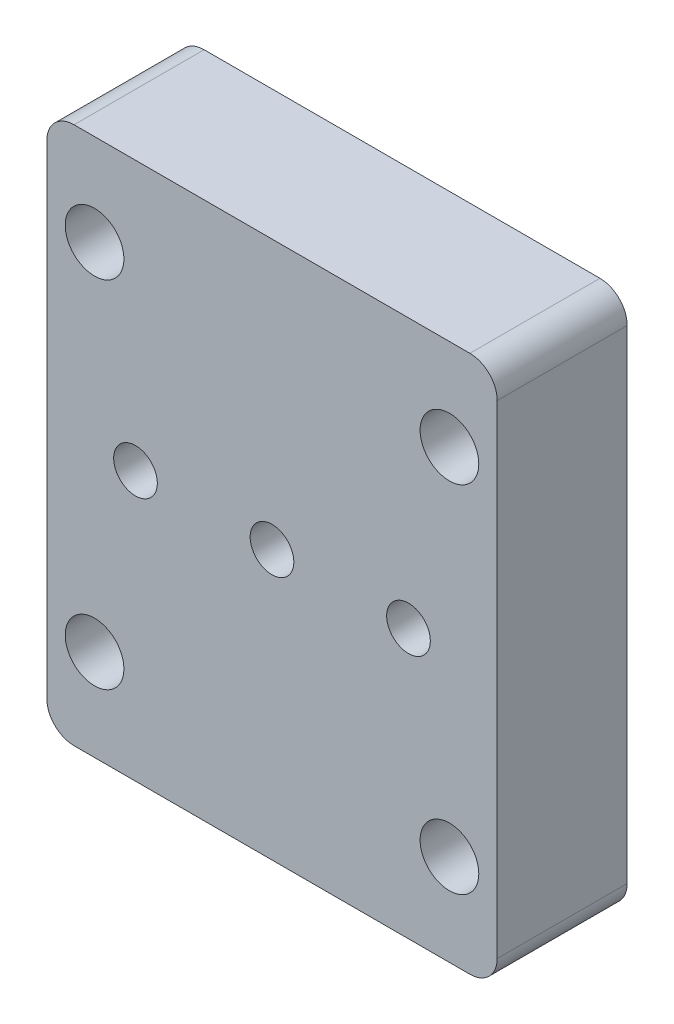
ISO-10303-21;
HEADER;
FILE_DESCRIPTION(('STEP AP214'),'2;1');
FILE_NAME('part.step','',(''),(''),'','','');
FILE_SCHEMA(('AUTOMOTIVE_DESIGN { 1 0 10303 214 1 1 1 1 }'));
ENDSEC;
DATA;
#1=APPLICATION_CONTEXT('core data for automotive mechanical design processes');
#2=APPLICATION_PROTOCOL_DEFINITION('international standard','automotive_design',2000,#1);
#3=PRODUCT_CONTEXT('',#1,'mechanical');
#4=PRODUCT('Part','Part','',(#3));
#5=PRODUCT_RELATED_PRODUCT_CATEGORY('part','',(#4));
#6=PRODUCT_DEFINITION_FORMATION('','',#4);
#7=PRODUCT_DEFINITION_CONTEXT('part definition',#1,'design');
#8=PRODUCT_DEFINITION('design','',#6,#7);
#9=PRODUCT_DEFINITION_SHAPE('','',#8);
#10=(LENGTH_UNIT() NAMED_UNIT(*) SI_UNIT(.MILLI.,.METRE.));
#11=(NAMED_UNIT(*) PLANE_ANGLE_UNIT() SI_UNIT($,.RADIAN.));
#12=(NAMED_UNIT(*) SI_UNIT($,.STERADIAN.) SOLID_ANGLE_UNIT());
#13=UNCERTAINTY_MEASURE_WITH_UNIT(LENGTH_MEASURE(1.E-05),#10,'distance_accuracy_value','');
#14=(GEOMETRIC_REPRESENTATION_CONTEXT(3) GLOBAL_UNCERTAINTY_ASSIGNED_CONTEXT((#13)) GLOBAL_UNIT_ASSIGNED_CONTEXT((#10,
#11,#12)) REPRESENTATION_CONTEXT('',''));
#15=CARTESIAN_POINT('',(0.,0.,0.));
#16=DIRECTION('',(0.,0.,1.));
#17=DIRECTION('',(1.,0.,0.));
#18=AXIS2_PLACEMENT_3D('',#15,#16,#17);
#19=CARTESIAN_POINT('',(-16.5,-19.7,9.525));
#20=DIRECTION('',(1.,0.,0.));
#21=DIRECTION('',(0.,0.,-1.));
#22=AXIS2_PLACEMENT_3D('',#19,#20,#21);
#23=PLANE('',#22);
#24=DIRECTION('',(0.,-1.,0.));
#25=VECTOR('',#24,1.);
#26=CARTESIAN_POINT('',(-16.5,-19.7,0.));
#27=LINE('',#26,#25);
#28=CARTESIAN_POINT('',(-16.5,17.7,0.));
#29=VERTEX_POINT('',#28);
#30=CARTESIAN_POINT('',(-16.5,-17.7,0.));
#31=VERTEX_POINT('',#30);
#32=EDGE_CURVE('E161',#29,#31,#27,.T.);
#33=ORIENTED_EDGE('',*,*,#32,.T.);
#34=DIRECTION('',(0.,0.,-1.));
#35=VECTOR('',#34,1.);
#36=CARTESIAN_POINT('',(-16.5,-17.7,9.525));
#37=LINE('',#36,#35);
#38=CARTESIAN_POINT('',(-16.5,-17.7,9.525));
#39=VERTEX_POINT('',#38);
#40=EDGE_CURVE('E11',#31,#39,#37,.F.);
#41=ORIENTED_EDGE('',*,*,#40,.T.);
#42=DIRECTION('',(0.,-1.,0.));
#43=VECTOR('',#42,1.);
#44=CARTESIAN_POINT('',(-16.5,-19.7,9.525));
#45=LINE('',#44,#43);
#46=CARTESIAN_POINT('',(-16.5,17.7,9.525));
#47=VERTEX_POINT('',#46);
#48=EDGE_CURVE('E129',#47,#39,#45,.T.);
#49=ORIENTED_EDGE('',*,*,#48,.F.);
#50=DIRECTION('',(0.,0.,-1.));
#51=VECTOR('',#50,1.);
#52=CARTESIAN_POINT('',(-16.5,17.7,9.525));
#53=LINE('',#52,#51);
#54=EDGE_CURVE('E45',#47,#29,#53,.T.);
#55=ORIENTED_EDGE('',*,*,#54,.T.);
#56=EDGE_LOOP('',(#33,#41,#49,#55));
#57=FACE_BOUND('',#56,.T.);
#58=ADVANCED_FACE('F37',(#57),#23,.F.);
#59=CARTESIAN_POINT('',(16.5,-19.7,9.525));
#60=DIRECTION('',(0.,1.,0.));
#61=DIRECTION('',(0.,0.,1.));
#62=AXIS2_PLACEMENT_3D('',#59,#60,#61);
#63=PLANE('',#62);
#64=DIRECTION('',(1.,0.,0.));
#65=VECTOR('',#64,1.);
#66=CARTESIAN_POINT('',(16.5,-19.7,0.));
#67=LINE('',#66,#65);
#68=CARTESIAN_POINT('',(-14.5,-19.7,0.));
#69=VERTEX_POINT('',#68);
#70=CARTESIAN_POINT('',(14.5,-19.7,0.));
#71=VERTEX_POINT('',#70);
#72=EDGE_CURVE('E134',#69,#71,#67,.T.);
#73=ORIENTED_EDGE('',*,*,#72,.T.);
#74=DIRECTION('',(0.,0.,-1.));
#75=VECTOR('',#74,1.);
#76=CARTESIAN_POINT('',(14.5,-19.7,9.525));
#77=LINE('',#76,#75);
#78=CARTESIAN_POINT('',(14.5,-19.7,9.525));
#79=VERTEX_POINT('',#78);
#80=EDGE_CURVE('E52',#71,#79,#77,.F.);
#81=ORIENTED_EDGE('',*,*,#80,.T.);
#82=DIRECTION('',(1.,0.,0.));
#83=VECTOR('',#82,1.);
#84=CARTESIAN_POINT('',(16.5,-19.7,9.525));
#85=LINE('',#84,#83);
#86=CARTESIAN_POINT('',(-14.5,-19.7,9.525));
#87=VERTEX_POINT('',#86);
#88=EDGE_CURVE('E132',#87,#79,#85,.T.);
#89=ORIENTED_EDGE('',*,*,#88,.F.);
#90=DIRECTION('',(0.,0.,-1.));
#91=VECTOR('',#90,1.);
#92=CARTESIAN_POINT('',(-14.5,-19.7,9.525));
#93=LINE('',#92,#91);
#94=EDGE_CURVE('E153',#87,#69,#93,.T.);
#95=ORIENTED_EDGE('',*,*,#94,.T.);
#96=EDGE_LOOP('',(#73,#81,#89,#95));
#97=FACE_BOUND('',#96,.T.);
#98=ADVANCED_FACE('F240',(#97),#63,.F.);
#99=CARTESIAN_POINT('',(16.5,-19.7,9.525));
#100=DIRECTION('',(-1.,0.,0.));
#101=DIRECTION('',(0.,0.,1.));
#102=AXIS2_PLACEMENT_3D('',#99,#100,#101);
#103=PLANE('',#102);
#104=DIRECTION('',(0.,1.,0.));
#105=VECTOR('',#104,1.);
#106=CARTESIAN_POINT('',(16.5,-19.7,0.));
#107=LINE('',#106,#105);
#108=CARTESIAN_POINT('',(16.5,-17.7,0.));
#109=VERTEX_POINT('',#108);
#110=CARTESIAN_POINT('',(16.5,17.7,0.));
#111=VERTEX_POINT('',#110);
#112=EDGE_CURVE('E130',#109,#111,#107,.T.);
#113=ORIENTED_EDGE('',*,*,#112,.T.);
#114=DIRECTION('',(0.,0.,-1.));
#115=VECTOR('',#114,1.);
#116=CARTESIAN_POINT('',(16.5,17.7,9.525));
#117=LINE('',#116,#115);
#118=CARTESIAN_POINT('',(16.5,17.7,9.525));
#119=VERTEX_POINT('',#118);
#120=EDGE_CURVE('E108',#111,#119,#117,.F.);
#121=ORIENTED_EDGE('',*,*,#120,.T.);
#122=DIRECTION('',(0.,1.,0.));
#123=VECTOR('',#122,1.);
#124=CARTESIAN_POINT('',(16.5,-19.7,9.525));
#125=LINE('',#124,#123);
#126=CARTESIAN_POINT('',(16.5,-17.7,9.525));
#127=VERTEX_POINT('',#126);
#128=EDGE_CURVE('E173',#127,#119,#125,.T.);
#129=ORIENTED_EDGE('',*,*,#128,.F.);
#130=DIRECTION('',(0.,0.,-1.));
#131=VECTOR('',#130,1.);
#132=CARTESIAN_POINT('',(16.5,-17.7,9.525));
#133=LINE('',#132,#131);
#134=EDGE_CURVE('E113',#127,#109,#133,.T.);
#135=ORIENTED_EDGE('',*,*,#134,.T.);
#136=EDGE_LOOP('',(#113,#121,#129,#135));
#137=FACE_BOUND('',#136,.T.);
#138=ADVANCED_FACE('F237',(#137),#103,.F.);
#139=CARTESIAN_POINT('',(16.5,19.7,9.525));
#140=DIRECTION('',(0.,-1.,0.));
#141=DIRECTION('',(1.,0.,0.));
#142=AXIS2_PLACEMENT_3D('',#139,#140,#141);
#143=PLANE('',#142);
#144=DIRECTION('',(-1.,0.,0.));
#145=VECTOR('',#144,1.);
#146=CARTESIAN_POINT('',(16.5,19.7,9.525));
#147=LINE('',#146,#145);
#148=CARTESIAN_POINT('',(14.5,19.7,9.525));
#149=VERTEX_POINT('',#148);
#150=CARTESIAN_POINT('',(-14.5,19.7,9.525));
#151=VERTEX_POINT('',#150);
#152=EDGE_CURVE('E123',#149,#151,#147,.T.);
#153=ORIENTED_EDGE('',*,*,#152,.F.);
#154=DIRECTION('',(0.,0.,-1.));
#155=VECTOR('',#154,1.);
#156=CARTESIAN_POINT('',(14.5,19.7,9.525));
#157=LINE('',#156,#155);
#158=CARTESIAN_POINT('',(14.5,19.7,0.));
#159=VERTEX_POINT('',#158);
#160=EDGE_CURVE('E107',#149,#159,#157,.T.);
#161=ORIENTED_EDGE('',*,*,#160,.T.);
#162=DIRECTION('',(-1.,0.,0.));
#163=VECTOR('',#162,1.);
#164=CARTESIAN_POINT('',(16.5,19.7,0.));
#165=LINE('',#164,#163);
#166=CARTESIAN_POINT('',(-14.5,19.7,0.));
#167=VERTEX_POINT('',#166);
#168=EDGE_CURVE('E120',#159,#167,#165,.T.);
#169=ORIENTED_EDGE('',*,*,#168,.T.);
#170=DIRECTION('',(0.,0.,-1.));
#171=VECTOR('',#170,1.);
#172=CARTESIAN_POINT('',(-14.5,19.7,9.525));
#173=LINE('',#172,#171);
#174=EDGE_CURVE('E125',#167,#151,#173,.F.);
#175=ORIENTED_EDGE('',*,*,#174,.T.);
#176=EDGE_LOOP('',(#153,#161,#169,#175));
#177=FACE_BOUND('',#176,.T.);
#178=ADVANCED_FACE('F119',(#177),#143,.F.);
#179=CARTESIAN_POINT('',(0.,0.,9.525));
#180=DIRECTION('',(0.,0.,1.));
#181=DIRECTION('',(1.,0.,0.));
#182=AXIS2_PLACEMENT_3D('',#179,#180,#181);
#183=PLANE('',#182);
#184=CARTESIAN_POINT('',(-13.,13.,9.525));
#185=DIRECTION('',(0.,0.,1.));
#186=DIRECTION('',(1.,0.,0.));
#187=AXIS2_PLACEMENT_3D('',#184,#185,#186);
#188=CIRCLE('',#187,2.15);
#189=CARTESIAN_POINT('',(-10.85,13.,9.525));
#190=VERTEX_POINT('',#189);
#191=EDGE_CURVE('E212',#190,#190,#188,.T.);
#192=ORIENTED_EDGE('',*,*,#191,.F.);
#193=EDGE_LOOP('',(#192));
#194=FACE_BOUND('',#193,.T.);
#195=CARTESIAN_POINT('',(-13.,-13.,9.525));
#196=DIRECTION('',(0.,0.,1.));
#197=DIRECTION('',(1.,0.,0.));
#198=AXIS2_PLACEMENT_3D('',#195,#196,#197);
#199=CIRCLE('',#198,2.15);
#200=CARTESIAN_POINT('',(-10.85,-13.,9.525));
#201=VERTEX_POINT('',#200);
#202=EDGE_CURVE('E206',#201,#201,#199,.T.);
#203=ORIENTED_EDGE('',*,*,#202,.F.);
#204=EDGE_LOOP('',(#203));
#205=FACE_BOUND('',#204,.T.);
#206=CARTESIAN_POINT('',(13.,-13.,9.525));
#207=DIRECTION('',(0.,0.,1.));
#208=DIRECTION('',(1.,0.,0.));
#209=AXIS2_PLACEMENT_3D('',#206,#207,#208);
#210=CIRCLE('',#209,2.15);
#211=CARTESIAN_POINT('',(15.15,-13.,9.525));
#212=VERTEX_POINT('',#211);
#213=EDGE_CURVE('E200',#212,#212,#210,.T.);
#214=ORIENTED_EDGE('',*,*,#213,.F.);
#215=EDGE_LOOP('',(#214));
#216=FACE_BOUND('',#215,.T.);
#217=CARTESIAN_POINT('',(13.,13.,9.525));
#218=DIRECTION('',(0.,0.,1.));
#219=DIRECTION('',(1.,0.,0.));
#220=AXIS2_PLACEMENT_3D('',#217,#218,#219);
#221=CIRCLE('',#220,2.15);
#222=CARTESIAN_POINT('',(15.15,13.,9.525));
#223=VERTEX_POINT('',#222);
#224=EDGE_CURVE('E194',#223,#223,#221,.T.);
#225=ORIENTED_EDGE('',*,*,#224,.F.);
#226=EDGE_LOOP('',(#225));
#227=FACE_BOUND('',#226,.T.);
#228=CARTESIAN_POINT('',(-10.,0.,9.525));
#229=DIRECTION('',(0.,0.,1.));
#230=DIRECTION('',(1.,0.,0.));
#231=AXIS2_PLACEMENT_3D('',#228,#229,#230);
#232=CIRCLE('',#231,1.6);
#233=CARTESIAN_POINT('',(-8.4,0.,9.525));
#234=VERTEX_POINT('',#233);
#235=EDGE_CURVE('E188',#234,#234,#232,.T.);
#236=ORIENTED_EDGE('',*,*,#235,.F.);
#237=EDGE_LOOP('',(#236));
#238=FACE_BOUND('',#237,.T.);
#239=CARTESIAN_POINT('',(0.,0.,9.525));
#240=DIRECTION('',(0.,0.,1.));
#241=DIRECTION('',(1.,0.,0.));
#242=AXIS2_PLACEMENT_3D('',#239,#240,#241);
#243=CIRCLE('',#242,1.6);
#244=CARTESIAN_POINT('',(1.6,0.,9.525));
#245=VERTEX_POINT('',#244);
#246=EDGE_CURVE('E182',#245,#245,#243,.T.);
#247=ORIENTED_EDGE('',*,*,#246,.F.);
#248=EDGE_LOOP('',(#247));
#249=FACE_BOUND('',#248,.T.);
#250=CARTESIAN_POINT('',(10.,0.,9.525));
#251=DIRECTION('',(0.,0.,1.));
#252=DIRECTION('',(1.,0.,0.));
#253=AXIS2_PLACEMENT_3D('',#250,#251,#252);
#254=CIRCLE('',#253,1.6);
#255=CARTESIAN_POINT('',(11.6,0.,9.525));
#256=VERTEX_POINT('',#255);
#257=EDGE_CURVE('E169',#256,#256,#254,.T.);
#258=ORIENTED_EDGE('',*,*,#257,.F.);
#259=EDGE_LOOP('',(#258));
#260=FACE_BOUND('',#259,.T.);
#261=ORIENTED_EDGE('',*,*,#128,.T.);
#262=CARTESIAN_POINT('',(14.5,17.7,9.525));
#263=DIRECTION('',(0.,0.,1.));
#264=DIRECTION('',(1.,0.,0.));
#265=AXIS2_PLACEMENT_3D('',#262,#263,#264);
#266=CIRCLE('',#265,2.);
#267=EDGE_CURVE('E151',#119,#149,#266,.T.);
#268=ORIENTED_EDGE('',*,*,#267,.T.);
#269=ORIENTED_EDGE('',*,*,#152,.T.);
#270=CARTESIAN_POINT('',(-14.5,17.7,9.525));
#271=DIRECTION('',(0.,0.,1.));
#272=DIRECTION('',(1.,0.,0.));
#273=AXIS2_PLACEMENT_3D('',#270,#271,#272);
#274=CIRCLE('',#273,2.);
#275=EDGE_CURVE('E146',#151,#47,#274,.T.);
#276=ORIENTED_EDGE('',*,*,#275,.T.);
#277=ORIENTED_EDGE('',*,*,#48,.T.);
#278=CARTESIAN_POINT('',(-14.5,-17.7,9.525));
#279=DIRECTION('',(0.,0.,1.));
#280=DIRECTION('',(1.,0.,0.));
#281=AXIS2_PLACEMENT_3D('',#278,#279,#280);
#282=CIRCLE('',#281,2.);
#283=EDGE_CURVE('E59',#39,#87,#282,.T.);
#284=ORIENTED_EDGE('',*,*,#283,.T.);
#285=ORIENTED_EDGE('',*,*,#88,.T.);
#286=CARTESIAN_POINT('',(14.5,-17.7,9.525));
#287=DIRECTION('',(0.,0.,1.));
#288=DIRECTION('',(1.,0.,0.));
#289=AXIS2_PLACEMENT_3D('',#286,#287,#288);
#290=CIRCLE('',#289,2.);
#291=EDGE_CURVE('E149',#79,#127,#290,.T.);
#292=ORIENTED_EDGE('',*,*,#291,.T.);
#293=EDGE_LOOP('',(#261,#268,#269,#276,#277,#284,#285,#292));
#294=FACE_BOUND('',#293,.T.);
#295=ADVANCED_FACE('F218',(#194,#205,#216,#227,#238,#249,#260,#294),#183,.T.);
#296=CARTESIAN_POINT('',(0.,0.,0.));
#297=DIRECTION('',(0.,0.,1.));
#298=DIRECTION('',(1.,0.,0.));
#299=AXIS2_PLACEMENT_3D('',#296,#297,#298);
#300=PLANE('',#299);
#301=CARTESIAN_POINT('',(-13.,13.,0.));
#302=DIRECTION('',(0.,0.,1.));
#303=DIRECTION('',(1.,0.,0.));
#304=AXIS2_PLACEMENT_3D('',#301,#302,#303);
#305=CIRCLE('',#304,2.15);
#306=CARTESIAN_POINT('',(-10.85,13.,0.));
#307=VERTEX_POINT('',#306);
#308=EDGE_CURVE('E209',#307,#307,#305,.T.);
#309=ORIENTED_EDGE('',*,*,#308,.T.);
#310=EDGE_LOOP('',(#309));
#311=FACE_BOUND('',#310,.T.);
#312=CARTESIAN_POINT('',(-13.,-13.,0.));
#313=DIRECTION('',(0.,0.,1.));
#314=DIRECTION('',(1.,0.,0.));
#315=AXIS2_PLACEMENT_3D('',#312,#313,#314);
#316=CIRCLE('',#315,2.15);
#317=CARTESIAN_POINT('',(-10.85,-13.,0.));
#318=VERTEX_POINT('',#317);
#319=EDGE_CURVE('E203',#318,#318,#316,.T.);
#320=ORIENTED_EDGE('',*,*,#319,.T.);
#321=EDGE_LOOP('',(#320));
#322=FACE_BOUND('',#321,.T.);
#323=CARTESIAN_POINT('',(13.,-13.,0.));
#324=DIRECTION('',(0.,0.,1.));
#325=DIRECTION('',(1.,0.,0.));
#326=AXIS2_PLACEMENT_3D('',#323,#324,#325);
#327=CIRCLE('',#326,2.15);
#328=CARTESIAN_POINT('',(15.15,-13.,0.));
#329=VERTEX_POINT('',#328);
#330=EDGE_CURVE('E197',#329,#329,#327,.T.);
#331=ORIENTED_EDGE('',*,*,#330,.T.);
#332=EDGE_LOOP('',(#331));
#333=FACE_BOUND('',#332,.T.);
#334=CARTESIAN_POINT('',(13.,13.,0.));
#335=DIRECTION('',(0.,0.,1.));
#336=DIRECTION('',(1.,0.,0.));
#337=AXIS2_PLACEMENT_3D('',#334,#335,#336);
#338=CIRCLE('',#337,2.15);
#339=CARTESIAN_POINT('',(15.15,13.,0.));
#340=VERTEX_POINT('',#339);
#341=EDGE_CURVE('E191',#340,#340,#338,.T.);
#342=ORIENTED_EDGE('',*,*,#341,.T.);
#343=EDGE_LOOP('',(#342));
#344=FACE_BOUND('',#343,.T.);
#345=CARTESIAN_POINT('',(-10.,0.,0.));
#346=DIRECTION('',(0.,0.,1.));
#347=DIRECTION('',(1.,0.,0.));
#348=AXIS2_PLACEMENT_3D('',#345,#346,#347);
#349=CIRCLE('',#348,1.6);
#350=CARTESIAN_POINT('',(-8.4,0.,0.));
#351=VERTEX_POINT('',#350);
#352=EDGE_CURVE('E185',#351,#351,#349,.T.);
#353=ORIENTED_EDGE('',*,*,#352,.T.);
#354=EDGE_LOOP('',(#353));
#355=FACE_BOUND('',#354,.T.);
#356=CARTESIAN_POINT('',(0.,0.,0.));
#357=DIRECTION('',(0.,0.,1.));
#358=DIRECTION('',(1.,0.,0.));
#359=AXIS2_PLACEMENT_3D('',#356,#357,#358);
#360=CIRCLE('',#359,1.6);
#361=CARTESIAN_POINT('',(1.6,0.,0.));
#362=VERTEX_POINT('',#361);
#363=EDGE_CURVE('E179',#362,#362,#360,.T.);
#364=ORIENTED_EDGE('',*,*,#363,.T.);
#365=EDGE_LOOP('',(#364));
#366=FACE_BOUND('',#365,.T.);
#367=CARTESIAN_POINT('',(10.,0.,0.));
#368=DIRECTION('',(0.,0.,1.));
#369=DIRECTION('',(1.,0.,0.));
#370=AXIS2_PLACEMENT_3D('',#367,#368,#369);
#371=CIRCLE('',#370,1.6);
#372=CARTESIAN_POINT('',(11.6,0.,0.));
#373=VERTEX_POINT('',#372);
#374=EDGE_CURVE('E166',#373,#373,#371,.T.);
#375=ORIENTED_EDGE('',*,*,#374,.T.);
#376=EDGE_LOOP('',(#375));
#377=FACE_BOUND('',#376,.T.);
#378=ORIENTED_EDGE('',*,*,#168,.F.);
#379=CARTESIAN_POINT('',(14.5,17.7,0.));
#380=DIRECTION('',(0.,0.,1.));
#381=DIRECTION('',(1.,0.,0.));
#382=AXIS2_PLACEMENT_3D('',#379,#380,#381);
#383=CIRCLE('',#382,2.);
#384=EDGE_CURVE('E103',#159,#111,#383,.F.);
#385=ORIENTED_EDGE('',*,*,#384,.T.);
#386=ORIENTED_EDGE('',*,*,#112,.F.);
#387=CARTESIAN_POINT('',(14.5,-17.7,0.));
#388=DIRECTION('',(0.,0.,1.));
#389=DIRECTION('',(1.,0.,0.));
#390=AXIS2_PLACEMENT_3D('',#387,#388,#389);
#391=CIRCLE('',#390,2.);
#392=EDGE_CURVE('E114',#109,#71,#391,.F.);
#393=ORIENTED_EDGE('',*,*,#392,.T.);
#394=ORIENTED_EDGE('',*,*,#72,.F.);
#395=CARTESIAN_POINT('',(-14.5,-17.7,0.));
#396=DIRECTION('',(0.,0.,1.));
#397=DIRECTION('',(1.,0.,0.));
#398=AXIS2_PLACEMENT_3D('',#395,#396,#397);
#399=CIRCLE('',#398,2.);
#400=EDGE_CURVE('E140',#69,#31,#399,.F.);
#401=ORIENTED_EDGE('',*,*,#400,.T.);
#402=ORIENTED_EDGE('',*,*,#32,.F.);
#403=CARTESIAN_POINT('',(-14.5,17.7,0.));
#404=DIRECTION('',(0.,0.,1.));
#405=DIRECTION('',(1.,0.,0.));
#406=AXIS2_PLACEMENT_3D('',#403,#404,#405);
#407=CIRCLE('',#406,2.);
#408=EDGE_CURVE('E124',#29,#167,#407,.F.);
#409=ORIENTED_EDGE('',*,*,#408,.T.);
#410=EDGE_LOOP('',(#378,#385,#386,#393,#394,#401,#402,#409));
#411=FACE_BOUND('',#410,.T.);
#412=ADVANCED_FACE('F127',(#311,#322,#333,#344,#355,#366,#377,#411),#300,.F.);
#413=CARTESIAN_POINT('',(10.,0.,9.525));
#414=DIRECTION('',(0.,0.,1.));
#415=DIRECTION('',(1.,0.,0.));
#416=AXIS2_PLACEMENT_3D('',#413,#414,#415);
#417=CYLINDRICAL_SURFACE('',#416,1.6);
#418=ORIENTED_EDGE('',*,*,#374,.F.);
#419=EDGE_LOOP('',(#418));
#420=FACE_BOUND('',#419,.T.);
#421=ORIENTED_EDGE('',*,*,#257,.T.);
#422=EDGE_LOOP('',(#421));
#423=FACE_BOUND('',#422,.T.);
#424=ADVANCED_FACE('F343',(#420,#423),#417,.F.);
#425=CARTESIAN_POINT('',(0.,0.,9.525));
#426=DIRECTION('',(0.,0.,1.));
#427=DIRECTION('',(1.,0.,0.));
#428=AXIS2_PLACEMENT_3D('',#425,#426,#427);
#429=CYLINDRICAL_SURFACE('',#428,1.6);
#430=ORIENTED_EDGE('',*,*,#363,.F.);
#431=EDGE_LOOP('',(#430));
#432=FACE_BOUND('',#431,.T.);
#433=ORIENTED_EDGE('',*,*,#246,.T.);
#434=EDGE_LOOP('',(#433));
#435=FACE_BOUND('',#434,.T.);
#436=ADVANCED_FACE('F333',(#432,#435),#429,.F.);
#437=CARTESIAN_POINT('',(-10.,0.,9.525));
#438=DIRECTION('',(0.,0.,1.));
#439=DIRECTION('',(1.,0.,0.));
#440=AXIS2_PLACEMENT_3D('',#437,#438,#439);
#441=CYLINDRICAL_SURFACE('',#440,1.6);
#442=ORIENTED_EDGE('',*,*,#352,.F.);
#443=EDGE_LOOP('',(#442));
#444=FACE_BOUND('',#443,.T.);
#445=ORIENTED_EDGE('',*,*,#235,.T.);
#446=EDGE_LOOP('',(#445));
#447=FACE_BOUND('',#446,.T.);
#448=ADVANCED_FACE('F323',(#444,#447),#441,.F.);
#449=CARTESIAN_POINT('',(13.,13.,9.525));
#450=DIRECTION('',(0.,0.,1.));
#451=DIRECTION('',(1.,0.,0.));
#452=AXIS2_PLACEMENT_3D('',#449,#450,#451);
#453=CYLINDRICAL_SURFACE('',#452,2.15);
#454=ORIENTED_EDGE('',*,*,#341,.F.);
#455=EDGE_LOOP('',(#454));
#456=FACE_BOUND('',#455,.T.);
#457=ORIENTED_EDGE('',*,*,#224,.T.);
#458=EDGE_LOOP('',(#457));
#459=FACE_BOUND('',#458,.T.);
#460=ADVANCED_FACE('F313',(#456,#459),#453,.F.);
#461=CARTESIAN_POINT('',(13.,-13.,9.525));
#462=DIRECTION('',(0.,0.,1.));
#463=DIRECTION('',(1.,0.,0.));
#464=AXIS2_PLACEMENT_3D('',#461,#462,#463);
#465=CYLINDRICAL_SURFACE('',#464,2.15);
#466=ORIENTED_EDGE('',*,*,#330,.F.);
#467=EDGE_LOOP('',(#466));
#468=FACE_BOUND('',#467,.T.);
#469=ORIENTED_EDGE('',*,*,#213,.T.);
#470=EDGE_LOOP('',(#469));
#471=FACE_BOUND('',#470,.T.);
#472=ADVANCED_FACE('F303',(#468,#471),#465,.F.);
#473=CARTESIAN_POINT('',(-13.,-13.,9.525));
#474=DIRECTION('',(0.,0.,1.));
#475=DIRECTION('',(1.,0.,0.));
#476=AXIS2_PLACEMENT_3D('',#473,#474,#475);
#477=CYLINDRICAL_SURFACE('',#476,2.15);
#478=ORIENTED_EDGE('',*,*,#319,.F.);
#479=EDGE_LOOP('',(#478));
#480=FACE_BOUND('',#479,.T.);
#481=ORIENTED_EDGE('',*,*,#202,.T.);
#482=EDGE_LOOP('',(#481));
#483=FACE_BOUND('',#482,.T.);
#484=ADVANCED_FACE('F293',(#480,#483),#477,.F.);
#485=CARTESIAN_POINT('',(-13.,13.,9.525));
#486=DIRECTION('',(0.,0.,1.));
#487=DIRECTION('',(1.,0.,0.));
#488=AXIS2_PLACEMENT_3D('',#485,#486,#487);
#489=CYLINDRICAL_SURFACE('',#488,2.15);
#490=ORIENTED_EDGE('',*,*,#308,.F.);
#491=EDGE_LOOP('',(#490));
#492=FACE_BOUND('',#491,.T.);
#493=ORIENTED_EDGE('',*,*,#191,.T.);
#494=EDGE_LOOP('',(#493));
#495=FACE_BOUND('',#494,.T.);
#496=ADVANCED_FACE('F216',(#492,#495),#489,.F.);
#497=CARTESIAN_POINT('',(14.5,17.7,9.525));
#498=DIRECTION('',(0.,0.,-1.));
#499=DIRECTION('',(-1.,0.,0.));
#500=AXIS2_PLACEMENT_3D('',#497,#498,#499);
#501=CYLINDRICAL_SURFACE('',#500,2.);
#502=ORIENTED_EDGE('',*,*,#267,.F.);
#503=ORIENTED_EDGE('',*,*,#120,.F.);
#504=ORIENTED_EDGE('',*,*,#384,.F.);
#505=ORIENTED_EDGE('',*,*,#160,.F.);
#506=EDGE_LOOP('',(#502,#503,#504,#505));
#507=FACE_BOUND('',#506,.T.);
#508=ADVANCED_FACE('F106',(#507),#501,.T.);
#509=CARTESIAN_POINT('',(14.5,-17.7,9.525));
#510=DIRECTION('',(0.,0.,-1.));
#511=DIRECTION('',(-1.,0.,0.));
#512=AXIS2_PLACEMENT_3D('',#509,#510,#511);
#513=CYLINDRICAL_SURFACE('',#512,2.);
#514=ORIENTED_EDGE('',*,*,#291,.F.);
#515=ORIENTED_EDGE('',*,*,#80,.F.);
#516=ORIENTED_EDGE('',*,*,#392,.F.);
#517=ORIENTED_EDGE('',*,*,#134,.F.);
#518=EDGE_LOOP('',(#514,#515,#516,#517));
#519=FACE_BOUND('',#518,.T.);
#520=ADVANCED_FACE('F239',(#519),#513,.T.);
#521=CARTESIAN_POINT('',(-14.5,-17.7,9.525));
#522=DIRECTION('',(0.,0.,-1.));
#523=DIRECTION('',(-1.,0.,0.));
#524=AXIS2_PLACEMENT_3D('',#521,#522,#523);
#525=CYLINDRICAL_SURFACE('',#524,2.);
#526=ORIENTED_EDGE('',*,*,#283,.F.);
#527=ORIENTED_EDGE('',*,*,#40,.F.);
#528=ORIENTED_EDGE('',*,*,#400,.F.);
#529=ORIENTED_EDGE('',*,*,#94,.F.);
#530=EDGE_LOOP('',(#526,#527,#528,#529));
#531=FACE_BOUND('',#530,.T.);
#532=ADVANCED_FACE('F243',(#531),#525,.T.);
#533=CARTESIAN_POINT('',(-14.5,17.7,9.525));
#534=DIRECTION('',(0.,0.,-1.));
#535=DIRECTION('',(-1.,0.,0.));
#536=AXIS2_PLACEMENT_3D('',#533,#534,#535);
#537=CYLINDRICAL_SURFACE('',#536,2.);
#538=ORIENTED_EDGE('',*,*,#275,.F.);
#539=ORIENTED_EDGE('',*,*,#174,.F.);
#540=ORIENTED_EDGE('',*,*,#408,.F.);
#541=ORIENTED_EDGE('',*,*,#54,.F.);
#542=EDGE_LOOP('',(#538,#539,#540,#541));
#543=FACE_BOUND('',#542,.T.);
#544=ADVANCED_FACE('F39',(#543),#537,.T.);
#545=CLOSED_SHELL('',(#58,#98,#138,#178,#295,#412,#424,#436,#448,#460,#472,#484,#496,#508,#520,
#532,#544));
#546=MANIFOLD_SOLID_BREP('B2',#545);
#547=ADVANCED_BREP_SHAPE_REPRESENTATION('',(#18,#546),#14);
#548=SHAPE_DEFINITION_REPRESENTATION(#9,#547);
ENDSEC;
END-ISO-10303-21;
